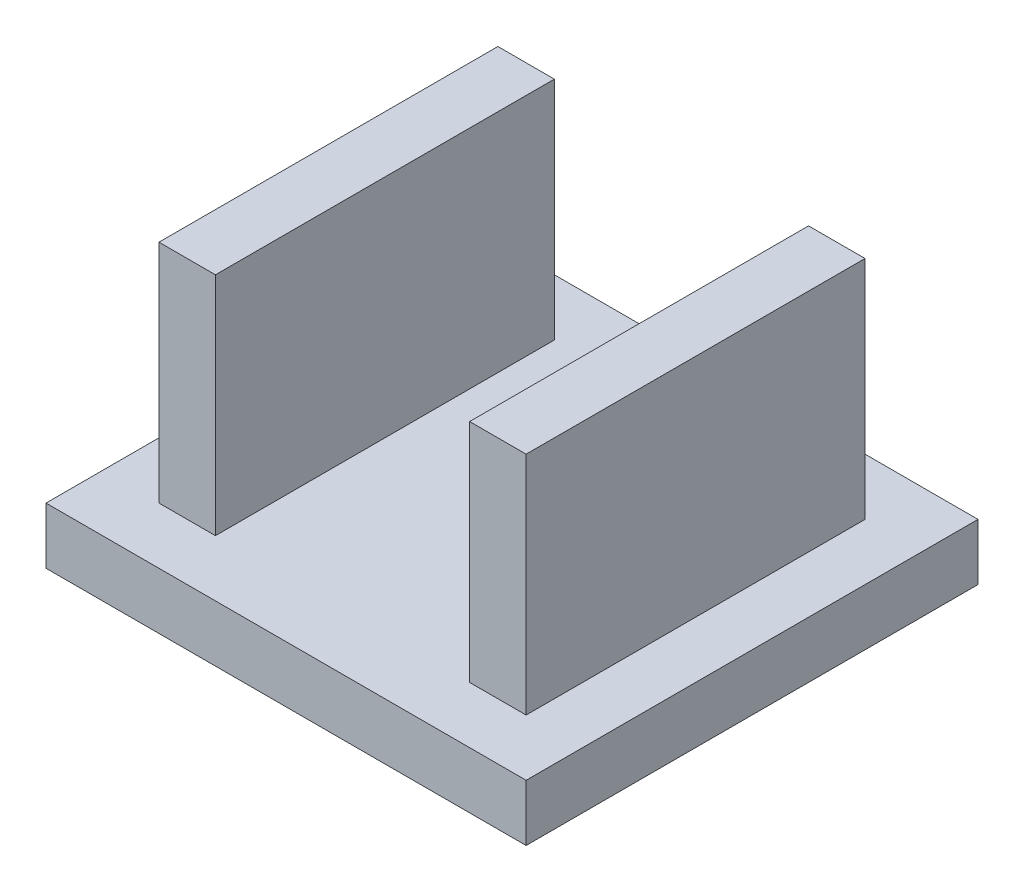
ISO-10303-21;
HEADER;
FILE_DESCRIPTION(('STEP AP214'),'2;1');
FILE_NAME('part.step','',(''),(''),'','','');
FILE_SCHEMA(('AUTOMOTIVE_DESIGN { 1 0 10303 214 1 1 1 1 }'));
ENDSEC;
DATA;
#1=APPLICATION_CONTEXT('core data for automotive mechanical design processes');
#2=APPLICATION_PROTOCOL_DEFINITION('international standard','automotive_design',2000,#1);
#3=PRODUCT_CONTEXT('',#1,'mechanical');
#4=PRODUCT('Part','Part','',(#3));
#5=PRODUCT_RELATED_PRODUCT_CATEGORY('part','',(#4));
#6=PRODUCT_DEFINITION_FORMATION('','',#4);
#7=PRODUCT_DEFINITION_CONTEXT('part definition',#1,'design');
#8=PRODUCT_DEFINITION('design','',#6,#7);
#9=PRODUCT_DEFINITION_SHAPE('','',#8);
#10=(LENGTH_UNIT() NAMED_UNIT(*) SI_UNIT(.MILLI.,.METRE.));
#11=(NAMED_UNIT(*) PLANE_ANGLE_UNIT() SI_UNIT($,.RADIAN.));
#12=(NAMED_UNIT(*) SI_UNIT($,.STERADIAN.) SOLID_ANGLE_UNIT());
#13=UNCERTAINTY_MEASURE_WITH_UNIT(LENGTH_MEASURE(1.E-05),#10,'distance_accuracy_value','');
#14=(GEOMETRIC_REPRESENTATION_CONTEXT(3) GLOBAL_UNCERTAINTY_ASSIGNED_CONTEXT((#13)) GLOBAL_UNIT_ASSIGNED_CONTEXT((#10,
#11,#12)) REPRESENTATION_CONTEXT('',''));
#15=CARTESIAN_POINT('',(0.,0.,0.));
#16=DIRECTION('',(0.,0.,1.));
#17=DIRECTION('',(1.,0.,0.));
#18=AXIS2_PLACEMENT_3D('',#15,#16,#17);
#19=CARTESIAN_POINT('',(0.,1.,0.));
#20=DIRECTION('',(0.,1.,0.));
#21=DIRECTION('',(0.,0.,1.));
#22=AXIS2_PLACEMENT_3D('',#19,#20,#21);
#23=PLANE('',#22);
#24=DIRECTION('',(0.,0.,-1.));
#25=VECTOR('',#24,1.);
#26=CARTESIAN_POINT('',(4.25,1.,-4.));
#27=LINE('',#26,#25);
#28=CARTESIAN_POINT('',(4.25,1.,4.));
#29=VERTEX_POINT('',#28);
#30=CARTESIAN_POINT('',(4.25,1.,-4.));
#31=VERTEX_POINT('',#30);
#32=EDGE_CURVE('E180',#29,#31,#27,.T.);
#33=ORIENTED_EDGE('',*,*,#32,.T.);
#34=DIRECTION('',(-1.,0.,0.));
#35=VECTOR('',#34,1.);
#36=CARTESIAN_POINT('',(-4.25,1.,-4.));
#37=LINE('',#36,#35);
#38=CARTESIAN_POINT('',(-4.25,1.,-4.));
#39=VERTEX_POINT('',#38);
#40=EDGE_CURVE('E183',#31,#39,#37,.T.);
#41=ORIENTED_EDGE('',*,*,#40,.T.);
#42=DIRECTION('',(0.,0.,1.));
#43=VECTOR('',#42,1.);
#44=CARTESIAN_POINT('',(-4.25,1.,-4.));
#45=LINE('',#44,#43);
#46=CARTESIAN_POINT('',(-4.25,1.,4.));
#47=VERTEX_POINT('',#46);
#48=EDGE_CURVE('E186',#39,#47,#45,.T.);
#49=ORIENTED_EDGE('',*,*,#48,.T.);
#50=DIRECTION('',(1.,0.,0.));
#51=VECTOR('',#50,1.);
#52=CARTESIAN_POINT('',(-4.25,1.,4.));
#53=LINE('',#52,#51);
#54=EDGE_CURVE('E188',#47,#29,#53,.T.);
#55=ORIENTED_EDGE('',*,*,#54,.T.);
#56=EDGE_LOOP('',(#33,#41,#49,#55));
#57=FACE_BOUND('',#56,.T.);
#58=DIRECTION('',(1.,0.,0.));
#59=VECTOR('',#58,1.);
#60=CARTESIAN_POINT('',(-3.25,1.,3.));
#61=LINE('',#60,#59);
#62=CARTESIAN_POINT('',(-3.25,1.,3.));
#63=VERTEX_POINT('',#62);
#64=CARTESIAN_POINT('',(-2.25,1.,3.));
#65=VERTEX_POINT('',#64);
#66=EDGE_CURVE('E151',#63,#65,#61,.T.);
#67=ORIENTED_EDGE('',*,*,#66,.F.);
#68=DIRECTION('',(0.,0.,1.));
#69=VECTOR('',#68,1.);
#70=CARTESIAN_POINT('',(-3.25,1.,-3.));
#71=LINE('',#70,#69);
#72=CARTESIAN_POINT('',(-3.25,1.,-3.));
#73=VERTEX_POINT('',#72);
#74=EDGE_CURVE('E148',#73,#63,#71,.T.);
#75=ORIENTED_EDGE('',*,*,#74,.F.);
#76=DIRECTION('',(-1.,0.,0.));
#77=VECTOR('',#76,1.);
#78=CARTESIAN_POINT('',(-3.25,1.,-3.));
#79=LINE('',#78,#77);
#80=CARTESIAN_POINT('',(-2.25,1.,-3.));
#81=VERTEX_POINT('',#80);
#82=EDGE_CURVE('E160',#81,#73,#79,.T.);
#83=ORIENTED_EDGE('',*,*,#82,.F.);
#84=DIRECTION('',(0.,0.,-1.));
#85=VECTOR('',#84,1.);
#86=CARTESIAN_POINT('',(-2.25,1.,-3.));
#87=LINE('',#86,#85);
#88=EDGE_CURVE('E168',#65,#81,#87,.T.);
#89=ORIENTED_EDGE('',*,*,#88,.F.);
#90=EDGE_LOOP('',(#67,#75,#83,#89));
#91=FACE_BOUND('',#90,.T.);
#92=DIRECTION('',(1.,0.,0.));
#93=VECTOR('',#92,1.);
#94=CARTESIAN_POINT('',(2.25,1.,3.));
#95=LINE('',#94,#93);
#96=CARTESIAN_POINT('',(2.25,1.,3.));
#97=VERTEX_POINT('',#96);
#98=CARTESIAN_POINT('',(3.25,1.,3.));
#99=VERTEX_POINT('',#98);
#100=EDGE_CURVE('E369',#97,#99,#95,.T.);
#101=ORIENTED_EDGE('',*,*,#100,.F.);
#102=DIRECTION('',(0.,0.,1.));
#103=VECTOR('',#102,1.);
#104=CARTESIAN_POINT('',(2.25,1.,-3.));
#105=LINE('',#104,#103);
#106=CARTESIAN_POINT('',(2.25,1.,-3.));
#107=VERTEX_POINT('',#106);
#108=EDGE_CURVE('E146',#107,#97,#105,.T.);
#109=ORIENTED_EDGE('',*,*,#108,.F.);
#110=DIRECTION('',(-1.,0.,0.));
#111=VECTOR('',#110,1.);
#112=CARTESIAN_POINT('',(2.25,1.,-3.));
#113=LINE('',#112,#111);
#114=CARTESIAN_POINT('',(3.25,1.,-3.));
#115=VERTEX_POINT('',#114);
#116=EDGE_CURVE('E142',#115,#107,#113,.T.);
#117=ORIENTED_EDGE('',*,*,#116,.F.);
#118=DIRECTION('',(0.,0.,-1.));
#119=VECTOR('',#118,1.);
#120=CARTESIAN_POINT('',(3.25,1.,-3.));
#121=LINE('',#120,#119);
#122=EDGE_CURVE('E366',#99,#115,#121,.T.);
#123=ORIENTED_EDGE('',*,*,#122,.F.);
#124=EDGE_LOOP('',(#101,#109,#117,#123));
#125=FACE_BOUND('',#124,.T.);
#126=ADVANCED_FACE('F33',(#57,#91,#125),#23,.T.);
#127=CARTESIAN_POINT('',(4.25,1.,-4.));
#128=DIRECTION('',(-1.,0.,0.));
#129=DIRECTION('',(0.,0.,1.));
#130=AXIS2_PLACEMENT_3D('',#127,#128,#129);
#131=PLANE('',#130);
#132=DIRECTION('',(0.,0.,-1.));
#133=VECTOR('',#132,1.);
#134=CARTESIAN_POINT('',(4.25,0.,-4.));
#135=LINE('',#134,#133);
#136=CARTESIAN_POINT('',(4.25,0.,4.));
#137=VERTEX_POINT('',#136);
#138=CARTESIAN_POINT('',(4.25,0.,-4.));
#139=VERTEX_POINT('',#138);
#140=EDGE_CURVE('E179',#137,#139,#135,.T.);
#141=ORIENTED_EDGE('',*,*,#140,.T.);
#142=DIRECTION('',(0.,-1.,0.));
#143=VECTOR('',#142,1.);
#144=CARTESIAN_POINT('',(4.25,1.,-4.));
#145=LINE('',#144,#143);
#146=EDGE_CURVE('E11',#31,#139,#145,.T.);
#147=ORIENTED_EDGE('',*,*,#146,.F.);
#148=ORIENTED_EDGE('',*,*,#32,.F.);
#149=DIRECTION('',(0.,-1.,0.));
#150=VECTOR('',#149,1.);
#151=CARTESIAN_POINT('',(4.25,1.,4.));
#152=LINE('',#151,#150);
#153=EDGE_CURVE('E190',#29,#137,#152,.T.);
#154=ORIENTED_EDGE('',*,*,#153,.T.);
#155=EDGE_LOOP('',(#141,#147,#148,#154));
#156=FACE_BOUND('',#155,.T.);
#157=ADVANCED_FACE('F35',(#156),#131,.F.);
#158=CARTESIAN_POINT('',(-4.25,1.,-4.));
#159=DIRECTION('',(0.,0.,1.));
#160=DIRECTION('',(1.,0.,0.));
#161=AXIS2_PLACEMENT_3D('',#158,#159,#160);
#162=PLANE('',#161);
#163=DIRECTION('',(-1.,0.,0.));
#164=VECTOR('',#163,1.);
#165=CARTESIAN_POINT('',(-4.25,0.,-4.));
#166=LINE('',#165,#164);
#167=CARTESIAN_POINT('',(-4.25,0.,-4.));
#168=VERTEX_POINT('',#167);
#169=EDGE_CURVE('E193',#139,#168,#166,.T.);
#170=ORIENTED_EDGE('',*,*,#169,.T.);
#171=DIRECTION('',(0.,-1.,0.));
#172=VECTOR('',#171,1.);
#173=CARTESIAN_POINT('',(-4.25,1.,-4.));
#174=LINE('',#173,#172);
#175=EDGE_CURVE('E41',#39,#168,#174,.T.);
#176=ORIENTED_EDGE('',*,*,#175,.F.);
#177=ORIENTED_EDGE('',*,*,#40,.F.);
#178=ORIENTED_EDGE('',*,*,#146,.T.);
#179=EDGE_LOOP('',(#170,#176,#177,#178));
#180=FACE_BOUND('',#179,.T.);
#181=ADVANCED_FACE('F223',(#180),#162,.F.);
#182=CARTESIAN_POINT('',(-4.25,1.,-4.));
#183=DIRECTION('',(1.,0.,0.));
#184=DIRECTION('',(0.,0.,-1.));
#185=AXIS2_PLACEMENT_3D('',#182,#183,#184);
#186=PLANE('',#185);
#187=DIRECTION('',(0.,0.,1.));
#188=VECTOR('',#187,1.);
#189=CARTESIAN_POINT('',(-4.25,0.,-4.));
#190=LINE('',#189,#188);
#191=CARTESIAN_POINT('',(-4.25,0.,4.));
#192=VERTEX_POINT('',#191);
#193=EDGE_CURVE('E195',#168,#192,#190,.T.);
#194=ORIENTED_EDGE('',*,*,#193,.T.);
#195=DIRECTION('',(0.,-1.,0.));
#196=VECTOR('',#195,1.);
#197=CARTESIAN_POINT('',(-4.25,1.,4.));
#198=LINE('',#197,#196);
#199=EDGE_CURVE('E200',#47,#192,#198,.T.);
#200=ORIENTED_EDGE('',*,*,#199,.F.);
#201=ORIENTED_EDGE('',*,*,#48,.F.);
#202=ORIENTED_EDGE('',*,*,#175,.T.);
#203=EDGE_LOOP('',(#194,#200,#201,#202));
#204=FACE_BOUND('',#203,.T.);
#205=ADVANCED_FACE('F207',(#204),#186,.F.);
#206=CARTESIAN_POINT('',(-4.25,1.,4.));
#207=DIRECTION('',(0.,0.,-1.));
#208=DIRECTION('',(-1.,0.,0.));
#209=AXIS2_PLACEMENT_3D('',#206,#207,#208);
#210=PLANE('',#209);
#211=DIRECTION('',(1.,0.,0.));
#212=VECTOR('',#211,1.);
#213=CARTESIAN_POINT('',(-4.25,0.,4.));
#214=LINE('',#213,#212);
#215=EDGE_CURVE('E184',#192,#137,#214,.T.);
#216=ORIENTED_EDGE('',*,*,#215,.T.);
#217=ORIENTED_EDGE('',*,*,#153,.F.);
#218=ORIENTED_EDGE('',*,*,#54,.F.);
#219=ORIENTED_EDGE('',*,*,#199,.T.);
#220=EDGE_LOOP('',(#216,#217,#218,#219));
#221=FACE_BOUND('',#220,.T.);
#222=ADVANCED_FACE('F216',(#221),#210,.F.);
#223=CARTESIAN_POINT('',(0.,0.,0.));
#224=DIRECTION('',(0.,1.,0.));
#225=DIRECTION('',(0.,0.,1.));
#226=AXIS2_PLACEMENT_3D('',#223,#224,#225);
#227=PLANE('',#226);
#228=ORIENTED_EDGE('',*,*,#140,.F.);
#229=ORIENTED_EDGE('',*,*,#215,.F.);
#230=ORIENTED_EDGE('',*,*,#193,.F.);
#231=ORIENTED_EDGE('',*,*,#169,.F.);
#232=EDGE_LOOP('',(#228,#229,#230,#231));
#233=FACE_BOUND('',#232,.T.);
#234=ADVANCED_FACE('F213',(#233),#227,.F.);
#235=CARTESIAN_POINT('',(-3.25,5.,-3.));
#236=DIRECTION('',(1.,0.,0.));
#237=DIRECTION('',(0.,0.,-1.));
#238=AXIS2_PLACEMENT_3D('',#235,#236,#237);
#239=PLANE('',#238);
#240=ORIENTED_EDGE('',*,*,#74,.T.);
#241=DIRECTION('',(0.,-1.,0.));
#242=VECTOR('',#241,1.);
#243=CARTESIAN_POINT('',(-3.25,5.,3.));
#244=LINE('',#243,#242);
#245=CARTESIAN_POINT('',(-3.25,5.,3.));
#246=VERTEX_POINT('',#245);
#247=EDGE_CURVE('E177',#246,#63,#244,.T.);
#248=ORIENTED_EDGE('',*,*,#247,.F.);
#249=DIRECTION('',(0.,0.,1.));
#250=VECTOR('',#249,1.);
#251=CARTESIAN_POINT('',(-3.25,5.,-3.));
#252=LINE('',#251,#250);
#253=CARTESIAN_POINT('',(-3.25,5.,-3.));
#254=VERTEX_POINT('',#253);
#255=EDGE_CURVE('E156',#254,#246,#252,.T.);
#256=ORIENTED_EDGE('',*,*,#255,.F.);
#257=DIRECTION('',(0.,-1.,0.));
#258=VECTOR('',#257,1.);
#259=CARTESIAN_POINT('',(-3.25,5.,-3.));
#260=LINE('',#259,#258);
#261=EDGE_CURVE('E165',#254,#73,#260,.T.);
#262=ORIENTED_EDGE('',*,*,#261,.T.);
#263=EDGE_LOOP('',(#240,#248,#256,#262));
#264=FACE_BOUND('',#263,.T.);
#265=ADVANCED_FACE('F236',(#264),#239,.F.);
#266=CARTESIAN_POINT('',(-3.25,5.,3.));
#267=DIRECTION('',(0.,0.,-1.));
#268=DIRECTION('',(-1.,0.,0.));
#269=AXIS2_PLACEMENT_3D('',#266,#267,#268);
#270=PLANE('',#269);
#271=ORIENTED_EDGE('',*,*,#66,.T.);
#272=DIRECTION('',(0.,-1.,0.));
#273=VECTOR('',#272,1.);
#274=CARTESIAN_POINT('',(-2.25,5.,3.));
#275=LINE('',#274,#273);
#276=CARTESIAN_POINT('',(-2.25,5.,3.));
#277=VERTEX_POINT('',#276);
#278=EDGE_CURVE('E174',#277,#65,#275,.T.);
#279=ORIENTED_EDGE('',*,*,#278,.F.);
#280=DIRECTION('',(1.,0.,0.));
#281=VECTOR('',#280,1.);
#282=CARTESIAN_POINT('',(-3.25,5.,3.));
#283=LINE('',#282,#281);
#284=EDGE_CURVE('E159',#246,#277,#283,.T.);
#285=ORIENTED_EDGE('',*,*,#284,.F.);
#286=ORIENTED_EDGE('',*,*,#247,.T.);
#287=EDGE_LOOP('',(#271,#279,#285,#286));
#288=FACE_BOUND('',#287,.T.);
#289=ADVANCED_FACE('F255',(#288),#270,.F.);
#290=CARTESIAN_POINT('',(-2.25,5.,-3.));
#291=DIRECTION('',(-1.,0.,0.));
#292=DIRECTION('',(0.,0.,1.));
#293=AXIS2_PLACEMENT_3D('',#290,#291,#292);
#294=PLANE('',#293);
#295=ORIENTED_EDGE('',*,*,#88,.T.);
#296=DIRECTION('',(0.,-1.,0.));
#297=VECTOR('',#296,1.);
#298=CARTESIAN_POINT('',(-2.25,5.,-3.));
#299=LINE('',#298,#297);
#300=CARTESIAN_POINT('',(-2.25,5.,-3.));
#301=VERTEX_POINT('',#300);
#302=EDGE_CURVE('E56',#301,#81,#299,.T.);
#303=ORIENTED_EDGE('',*,*,#302,.F.);
#304=DIRECTION('',(0.,0.,-1.));
#305=VECTOR('',#304,1.);
#306=CARTESIAN_POINT('',(-2.25,5.,-3.));
#307=LINE('',#306,#305);
#308=EDGE_CURVE('E162',#277,#301,#307,.T.);
#309=ORIENTED_EDGE('',*,*,#308,.F.);
#310=ORIENTED_EDGE('',*,*,#278,.T.);
#311=EDGE_LOOP('',(#295,#303,#309,#310));
#312=FACE_BOUND('',#311,.T.);
#313=ADVANCED_FACE('F262',(#312),#294,.F.);
#314=CARTESIAN_POINT('',(-3.25,5.,-3.));
#315=DIRECTION('',(0.,0.,1.));
#316=DIRECTION('',(1.,0.,0.));
#317=AXIS2_PLACEMENT_3D('',#314,#315,#316);
#318=PLANE('',#317);
#319=ORIENTED_EDGE('',*,*,#82,.T.);
#320=ORIENTED_EDGE('',*,*,#261,.F.);
#321=DIRECTION('',(-1.,0.,0.));
#322=VECTOR('',#321,1.);
#323=CARTESIAN_POINT('',(-3.25,5.,-3.));
#324=LINE('',#323,#322);
#325=EDGE_CURVE('E164',#301,#254,#324,.T.);
#326=ORIENTED_EDGE('',*,*,#325,.F.);
#327=ORIENTED_EDGE('',*,*,#302,.T.);
#328=EDGE_LOOP('',(#319,#320,#326,#327));
#329=FACE_BOUND('',#328,.T.);
#330=ADVANCED_FACE('F269',(#329),#318,.F.);
#331=CARTESIAN_POINT('',(0.,5.,0.));
#332=DIRECTION('',(0.,1.,0.));
#333=DIRECTION('',(0.,0.,1.));
#334=AXIS2_PLACEMENT_3D('',#331,#332,#333);
#335=PLANE('',#334);
#336=ORIENTED_EDGE('',*,*,#255,.T.);
#337=ORIENTED_EDGE('',*,*,#284,.T.);
#338=ORIENTED_EDGE('',*,*,#308,.T.);
#339=ORIENTED_EDGE('',*,*,#325,.T.);
#340=EDGE_LOOP('',(#336,#337,#338,#339));
#341=FACE_BOUND('',#340,.T.);
#342=ADVANCED_FACE('F277',(#341),#335,.T.);
#343=CARTESIAN_POINT('',(2.25,5.,-3.));
#344=DIRECTION('',(1.,0.,0.));
#345=DIRECTION('',(0.,0.,-1.));
#346=AXIS2_PLACEMENT_3D('',#343,#344,#345);
#347=PLANE('',#346);
#348=ORIENTED_EDGE('',*,*,#108,.T.);
#349=DIRECTION('',(0.,-1.,0.));
#350=VECTOR('',#349,1.);
#351=CARTESIAN_POINT('',(2.25,5.,3.));
#352=LINE('',#351,#350);
#353=CARTESIAN_POINT('',(2.25,5.,3.));
#354=VERTEX_POINT('',#353);
#355=EDGE_CURVE('E127',#354,#97,#352,.T.);
#356=ORIENTED_EDGE('',*,*,#355,.F.);
#357=DIRECTION('',(0.,0.,1.));
#358=VECTOR('',#357,1.);
#359=CARTESIAN_POINT('',(2.25,5.,-3.));
#360=LINE('',#359,#358);
#361=CARTESIAN_POINT('',(2.25,5.,-3.));
#362=VERTEX_POINT('',#361);
#363=EDGE_CURVE('E134',#362,#354,#360,.T.);
#364=ORIENTED_EDGE('',*,*,#363,.F.);
#365=DIRECTION('',(0.,-1.,0.));
#366=VECTOR('',#365,1.);
#367=CARTESIAN_POINT('',(2.25,5.,-3.));
#368=LINE('',#367,#366);
#369=EDGE_CURVE('E363',#362,#107,#368,.T.);
#370=ORIENTED_EDGE('',*,*,#369,.T.);
#371=EDGE_LOOP('',(#348,#356,#364,#370));
#372=FACE_BOUND('',#371,.T.);
#373=ADVANCED_FACE('F144',(#372),#347,.F.);
#374=CARTESIAN_POINT('',(2.25,5.,3.));
#375=DIRECTION('',(0.,0.,-1.));
#376=DIRECTION('',(-1.,0.,0.));
#377=AXIS2_PLACEMENT_3D('',#374,#375,#376);
#378=PLANE('',#377);
#379=ORIENTED_EDGE('',*,*,#100,.T.);
#380=DIRECTION('',(0.,-1.,0.));
#381=VECTOR('',#380,1.);
#382=CARTESIAN_POINT('',(3.25,5.,3.));
#383=LINE('',#382,#381);
#384=CARTESIAN_POINT('',(3.25,5.,3.));
#385=VERTEX_POINT('',#384);
#386=EDGE_CURVE('E130',#385,#99,#383,.T.);
#387=ORIENTED_EDGE('',*,*,#386,.F.);
#388=DIRECTION('',(1.,0.,0.));
#389=VECTOR('',#388,1.);
#390=CARTESIAN_POINT('',(2.25,5.,3.));
#391=LINE('',#390,#389);
#392=EDGE_CURVE('E123',#354,#385,#391,.T.);
#393=ORIENTED_EDGE('',*,*,#392,.F.);
#394=ORIENTED_EDGE('',*,*,#355,.T.);
#395=EDGE_LOOP('',(#379,#387,#393,#394));
#396=FACE_BOUND('',#395,.T.);
#397=ADVANCED_FACE('F125',(#396),#378,.F.);
#398=CARTESIAN_POINT('',(3.25,5.,-3.));
#399=DIRECTION('',(-1.,0.,0.));
#400=DIRECTION('',(0.,0.,1.));
#401=AXIS2_PLACEMENT_3D('',#398,#399,#400);
#402=PLANE('',#401);
#403=ORIENTED_EDGE('',*,*,#122,.T.);
#404=DIRECTION('',(0.,-1.,0.));
#405=VECTOR('',#404,1.);
#406=CARTESIAN_POINT('',(3.25,5.,-3.));
#407=LINE('',#406,#405);
#408=CARTESIAN_POINT('',(3.25,5.,-3.));
#409=VERTEX_POINT('',#408);
#410=EDGE_CURVE('E48',#409,#115,#407,.T.);
#411=ORIENTED_EDGE('',*,*,#410,.F.);
#412=DIRECTION('',(0.,0.,-1.));
#413=VECTOR('',#412,1.);
#414=CARTESIAN_POINT('',(3.25,5.,-3.));
#415=LINE('',#414,#413);
#416=EDGE_CURVE('E133',#385,#409,#415,.T.);
#417=ORIENTED_EDGE('',*,*,#416,.F.);
#418=ORIENTED_EDGE('',*,*,#386,.T.);
#419=EDGE_LOOP('',(#403,#411,#417,#418));
#420=FACE_BOUND('',#419,.T.);
#421=ADVANCED_FACE('F297',(#420),#402,.F.);
#422=CARTESIAN_POINT('',(2.25,5.,-3.));
#423=DIRECTION('',(0.,0.,1.));
#424=DIRECTION('',(1.,0.,0.));
#425=AXIS2_PLACEMENT_3D('',#422,#423,#424);
#426=PLANE('',#425);
#427=ORIENTED_EDGE('',*,*,#116,.T.);
#428=ORIENTED_EDGE('',*,*,#369,.F.);
#429=DIRECTION('',(-1.,0.,0.));
#430=VECTOR('',#429,1.);
#431=CARTESIAN_POINT('',(2.25,5.,-3.));
#432=LINE('',#431,#430);
#433=EDGE_CURVE('E138',#409,#362,#432,.T.);
#434=ORIENTED_EDGE('',*,*,#433,.F.);
#435=ORIENTED_EDGE('',*,*,#410,.T.);
#436=EDGE_LOOP('',(#427,#428,#434,#435));
#437=FACE_BOUND('',#436,.T.);
#438=ADVANCED_FACE('F304',(#437),#426,.F.);
#439=CARTESIAN_POINT('',(0.,5.,0.));
#440=DIRECTION('',(0.,1.,0.));
#441=DIRECTION('',(0.,0.,1.));
#442=AXIS2_PLACEMENT_3D('',#439,#440,#441);
#443=PLANE('',#442);
#444=ORIENTED_EDGE('',*,*,#363,.T.);
#445=ORIENTED_EDGE('',*,*,#392,.T.);
#446=ORIENTED_EDGE('',*,*,#416,.T.);
#447=ORIENTED_EDGE('',*,*,#433,.T.);
#448=EDGE_LOOP('',(#444,#445,#446,#447));
#449=FACE_BOUND('',#448,.T.);
#450=ADVANCED_FACE('F137',(#449),#443,.T.);
#451=CLOSED_SHELL('',(#126,#157,#181,#205,#222,#234,#265,#289,#313,#330,#342,#373,#397,#421,
#438,#450));
#452=MANIFOLD_SOLID_BREP('B2',#451);
#453=ADVANCED_BREP_SHAPE_REPRESENTATION('',(#18,#452),#14);
#454=SHAPE_DEFINITION_REPRESENTATION(#9,#453);
ENDSEC;
END-ISO-10303-21;
